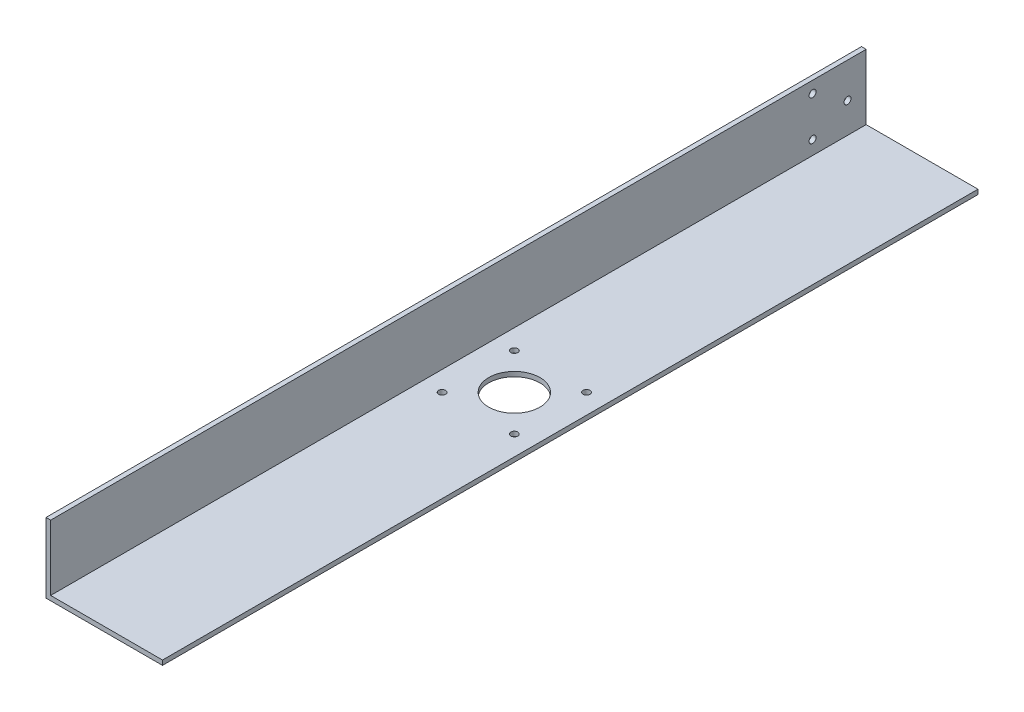
ISO-10303-21;
HEADER;
FILE_DESCRIPTION(('STEP AP214'),'2;1');
FILE_NAME('part.step','',(''),(''),'','','');
FILE_SCHEMA(('AUTOMOTIVE_DESIGN { 1 0 10303 214 1 1 1 1 }'));
ENDSEC;
DATA;
#1=APPLICATION_CONTEXT('core data for automotive mechanical design processes');
#2=APPLICATION_PROTOCOL_DEFINITION('international standard','automotive_design',2000,#1);
#3=PRODUCT_CONTEXT('',#1,'mechanical');
#4=PRODUCT('Part','Part','',(#3));
#5=PRODUCT_RELATED_PRODUCT_CATEGORY('part','',(#4));
#6=PRODUCT_DEFINITION_FORMATION('','',#4);
#7=PRODUCT_DEFINITION_CONTEXT('part definition',#1,'design');
#8=PRODUCT_DEFINITION('design','',#6,#7);
#9=PRODUCT_DEFINITION_SHAPE('','',#8);
#10=(LENGTH_UNIT() NAMED_UNIT(*) SI_UNIT(.MILLI.,.METRE.));
#11=(NAMED_UNIT(*) PLANE_ANGLE_UNIT() SI_UNIT($,.RADIAN.));
#12=(NAMED_UNIT(*) SI_UNIT($,.STERADIAN.) SOLID_ANGLE_UNIT());
#13=UNCERTAINTY_MEASURE_WITH_UNIT(LENGTH_MEASURE(1.E-05),#10,'distance_accuracy_value','');
#14=(GEOMETRIC_REPRESENTATION_CONTEXT(3) GLOBAL_UNCERTAINTY_ASSIGNED_CONTEXT((#13)) GLOBAL_UNIT_ASSIGNED_CONTEXT((#10,
#11,#12)) REPRESENTATION_CONTEXT('',''));
#15=CARTESIAN_POINT('',(0.,0.,0.));
#16=DIRECTION('',(0.,0.,1.));
#17=DIRECTION('',(1.,0.,0.));
#18=AXIS2_PLACEMENT_3D('',#15,#16,#17);
#19=CARTESIAN_POINT('',(0.,0.,0.));
#20=DIRECTION('',(0.,0.,-1.));
#21=DIRECTION('',(-1.,0.,0.));
#22=AXIS2_PLACEMENT_3D('',#19,#20,#21);
#23=PLANE('',#22);
#24=DIRECTION('',(1.,0.,0.));
#25=VECTOR('',#24,1.);
#26=CARTESIAN_POINT('',(50.,0.,0.));
#27=LINE('',#26,#25);
#28=CARTESIAN_POINT('',(0.,0.,0.));
#29=VERTEX_POINT('',#28);
#30=CARTESIAN_POINT('',(50.,0.,0.));
#31=VERTEX_POINT('',#30);
#32=EDGE_CURVE('E99',#29,#31,#27,.T.);
#33=ORIENTED_EDGE('',*,*,#32,.F.);
#34=DIRECTION('',(0.,-1.,0.));
#35=VECTOR('',#34,1.);
#36=CARTESIAN_POINT('',(0.,0.,0.));
#37=LINE('',#36,#35);
#38=CARTESIAN_POINT('',(0.,30.,0.));
#39=VERTEX_POINT('',#38);
#40=EDGE_CURVE('E121',#39,#29,#37,.T.);
#41=ORIENTED_EDGE('',*,*,#40,.F.);
#42=DIRECTION('',(-1.,0.,0.));
#43=VECTOR('',#42,1.);
#44=CARTESIAN_POINT('',(0.,30.,0.));
#45=LINE('',#44,#43);
#46=CARTESIAN_POINT('',(2.,30.,0.));
#47=VERTEX_POINT('',#46);
#48=EDGE_CURVE('E118',#47,#39,#45,.T.);
#49=ORIENTED_EDGE('',*,*,#48,.F.);
#50=DIRECTION('',(0.,1.,0.));
#51=VECTOR('',#50,1.);
#52=CARTESIAN_POINT('',(2.,30.,0.));
#53=LINE('',#52,#51);
#54=CARTESIAN_POINT('',(2.,2.,0.));
#55=VERTEX_POINT('',#54);
#56=EDGE_CURVE('E115',#55,#47,#53,.T.);
#57=ORIENTED_EDGE('',*,*,#56,.F.);
#58=DIRECTION('',(-1.,0.,0.));
#59=VECTOR('',#58,1.);
#60=CARTESIAN_POINT('',(2.,2.,0.));
#61=LINE('',#60,#59);
#62=CARTESIAN_POINT('',(50.,2.,0.));
#63=VERTEX_POINT('',#62);
#64=EDGE_CURVE('E102',#63,#55,#61,.T.);
#65=ORIENTED_EDGE('',*,*,#64,.F.);
#66=DIRECTION('',(0.,1.,0.));
#67=VECTOR('',#66,1.);
#68=CARTESIAN_POINT('',(50.,2.,0.));
#69=LINE('',#68,#67);
#70=EDGE_CURVE('E91',#31,#63,#69,.T.);
#71=ORIENTED_EDGE('',*,*,#70,.F.);
#72=EDGE_LOOP('',(#33,#41,#49,#57,#65,#71));
#73=FACE_BOUND('',#72,.T.);
#74=ADVANCED_FACE('F35',(#73),#23,.T.);
#75=CARTESIAN_POINT('',(0.,0.,408.309518948453));
#76=DIRECTION('',(1.,0.,0.));
#77=DIRECTION('',(0.,0.,-1.));
#78=AXIS2_PLACEMENT_3D('',#75,#76,#77);
#79=PLANE('',#78);
#80=CARTESIAN_POINT('',(0.,7.99999999999998,22.9999999999999));
#81=DIRECTION('',(-1.,0.,0.));
#82=DIRECTION('',(0.,0.,1.));
#83=AXIS2_PLACEMENT_3D('',#80,#81,#82);
#84=CIRCLE('',#83,1.49999999999999);
#85=CARTESIAN_POINT('',(0.,7.99999999999998,24.4999999999999));
#86=VERTEX_POINT('',#85);
#87=EDGE_CURVE('E181',#86,#86,#84,.T.);
#88=ORIENTED_EDGE('',*,*,#87,.F.);
#89=EDGE_LOOP('',(#88));
#90=FACE_BOUND('',#89,.T.);
#91=CARTESIAN_POINT('',(0.,25.,22.9999999999999));
#92=DIRECTION('',(-1.,0.,0.));
#93=DIRECTION('',(0.,0.,1.));
#94=AXIS2_PLACEMENT_3D('',#91,#92,#93);
#95=CIRCLE('',#94,1.49999999999999);
#96=CARTESIAN_POINT('',(0.,25.,24.4999999999999));
#97=VERTEX_POINT('',#96);
#98=EDGE_CURVE('E175',#97,#97,#95,.T.);
#99=ORIENTED_EDGE('',*,*,#98,.F.);
#100=EDGE_LOOP('',(#99));
#101=FACE_BOUND('',#100,.T.);
#102=CARTESIAN_POINT('',(0.,15.,7.99999999999994));
#103=DIRECTION('',(-1.,0.,0.));
#104=DIRECTION('',(0.,0.,1.));
#105=AXIS2_PLACEMENT_3D('',#102,#103,#104);
#106=CIRCLE('',#105,1.49999999999999);
#107=CARTESIAN_POINT('',(0.,15.,9.49999999999993));
#108=VERTEX_POINT('',#107);
#109=EDGE_CURVE('E169',#108,#108,#106,.T.);
#110=ORIENTED_EDGE('',*,*,#109,.F.);
#111=EDGE_LOOP('',(#110));
#112=FACE_BOUND('',#111,.T.);
#113=DIRECTION('',(0.,0.,-1.));
#114=VECTOR('',#113,1.);
#115=CARTESIAN_POINT('',(0.,0.,408.309518948453));
#116=LINE('',#115,#114);
#117=CARTESIAN_POINT('',(0.,0.,350.));
#118=VERTEX_POINT('',#117);
#119=EDGE_CURVE('E105',#118,#29,#116,.T.);
#120=ORIENTED_EDGE('',*,*,#119,.F.);
#121=DIRECTION('',(0.,1.,0.));
#122=VECTOR('',#121,1.);
#123=CARTESIAN_POINT('',(0.,0.,350.));
#124=LINE('',#123,#122);
#125=CARTESIAN_POINT('',(0.,30.,350.));
#126=VERTEX_POINT('',#125);
#127=EDGE_CURVE('E39',#118,#126,#124,.T.);
#128=ORIENTED_EDGE('',*,*,#127,.T.);
#129=DIRECTION('',(0.,0.,-1.));
#130=VECTOR('',#129,1.);
#131=CARTESIAN_POINT('',(0.,30.,408.309518948453));
#132=LINE('',#131,#130);
#133=EDGE_CURVE('E124',#126,#39,#132,.T.);
#134=ORIENTED_EDGE('',*,*,#133,.T.);
#135=ORIENTED_EDGE('',*,*,#40,.T.);
#136=EDGE_LOOP('',(#120,#128,#134,#135));
#137=FACE_BOUND('',#136,.T.);
#138=ADVANCED_FACE('F187',(#90,#101,#112,#137),#79,.F.);
#139=CARTESIAN_POINT('',(0.,30.,408.309518948453));
#140=DIRECTION('',(0.,-1.,0.));
#141=DIRECTION('',(0.,0.,-1.));
#142=AXIS2_PLACEMENT_3D('',#139,#140,#141);
#143=PLANE('',#142);
#144=ORIENTED_EDGE('',*,*,#133,.F.);
#145=DIRECTION('',(1.,0.,0.));
#146=VECTOR('',#145,1.);
#147=CARTESIAN_POINT('',(0.,30.,350.));
#148=LINE('',#147,#146);
#149=CARTESIAN_POINT('',(2.,30.,350.));
#150=VERTEX_POINT('',#149);
#151=EDGE_CURVE('E135',#126,#150,#148,.T.);
#152=ORIENTED_EDGE('',*,*,#151,.T.);
#153=DIRECTION('',(0.,0.,-1.));
#154=VECTOR('',#153,1.);
#155=CARTESIAN_POINT('',(2.,30.,408.309518948453));
#156=LINE('',#155,#154);
#157=EDGE_CURVE('E126',#150,#47,#156,.T.);
#158=ORIENTED_EDGE('',*,*,#157,.T.);
#159=ORIENTED_EDGE('',*,*,#48,.T.);
#160=EDGE_LOOP('',(#144,#152,#158,#159));
#161=FACE_BOUND('',#160,.T.);
#162=ADVANCED_FACE('F190',(#161),#143,.F.);
#163=CARTESIAN_POINT('',(2.,30.,408.309518948453));
#164=DIRECTION('',(-1.,0.,0.));
#165=DIRECTION('',(0.,0.,1.));
#166=AXIS2_PLACEMENT_3D('',#163,#164,#165);
#167=PLANE('',#166);
#168=CARTESIAN_POINT('',(2.,7.99999999999998,22.9999999999999));
#169=DIRECTION('',(-1.,0.,0.));
#170=DIRECTION('',(0.,0.,1.));
#171=AXIS2_PLACEMENT_3D('',#168,#169,#170);
#172=CIRCLE('',#171,1.5);
#173=CARTESIAN_POINT('',(2.,7.99999999999998,24.4999999999999));
#174=VERTEX_POINT('',#173);
#175=EDGE_CURVE('E178',#174,#174,#172,.T.);
#176=ORIENTED_EDGE('',*,*,#175,.T.);
#177=EDGE_LOOP('',(#176));
#178=FACE_BOUND('',#177,.T.);
#179=CARTESIAN_POINT('',(2.,25.,22.9999999999999));
#180=DIRECTION('',(-1.,0.,0.));
#181=DIRECTION('',(0.,0.,1.));
#182=AXIS2_PLACEMENT_3D('',#179,#180,#181);
#183=CIRCLE('',#182,1.5);
#184=CARTESIAN_POINT('',(2.,25.,24.4999999999999));
#185=VERTEX_POINT('',#184);
#186=EDGE_CURVE('E172',#185,#185,#183,.T.);
#187=ORIENTED_EDGE('',*,*,#186,.T.);
#188=EDGE_LOOP('',(#187));
#189=FACE_BOUND('',#188,.T.);
#190=CARTESIAN_POINT('',(2.,15.,7.99999999999994));
#191=DIRECTION('',(-1.,0.,0.));
#192=DIRECTION('',(0.,0.,1.));
#193=AXIS2_PLACEMENT_3D('',#190,#191,#192);
#194=CIRCLE('',#193,1.5);
#195=CARTESIAN_POINT('',(2.,15.,9.49999999999994));
#196=VERTEX_POINT('',#195);
#197=EDGE_CURVE('E153',#196,#196,#194,.T.);
#198=ORIENTED_EDGE('',*,*,#197,.T.);
#199=EDGE_LOOP('',(#198));
#200=FACE_BOUND('',#199,.T.);
#201=ORIENTED_EDGE('',*,*,#157,.F.);
#202=DIRECTION('',(0.,-1.,0.));
#203=VECTOR('',#202,1.);
#204=CARTESIAN_POINT('',(2.,30.,350.));
#205=LINE('',#204,#203);
#206=CARTESIAN_POINT('',(2.,2.,350.));
#207=VERTEX_POINT('',#206);
#208=EDGE_CURVE('E133',#150,#207,#205,.T.);
#209=ORIENTED_EDGE('',*,*,#208,.T.);
#210=DIRECTION('',(0.,0.,-1.));
#211=VECTOR('',#210,1.);
#212=CARTESIAN_POINT('',(2.,2.,408.309518948453));
#213=LINE('',#212,#211);
#214=EDGE_CURVE('E128',#207,#55,#213,.T.);
#215=ORIENTED_EDGE('',*,*,#214,.T.);
#216=ORIENTED_EDGE('',*,*,#56,.T.);
#217=EDGE_LOOP('',(#201,#209,#215,#216));
#218=FACE_BOUND('',#217,.T.);
#219=ADVANCED_FACE('F202',(#178,#189,#200,#218),#167,.F.);
#220=CARTESIAN_POINT('',(2.,2.,408.309518948453));
#221=DIRECTION('',(0.,-1.,0.));
#222=DIRECTION('',(0.,0.,-1.));
#223=AXIS2_PLACEMENT_3D('',#220,#221,#222);
#224=PLANE('',#223);
#225=CARTESIAN_POINT('',(41.5000000000025,2.,159.5));
#226=DIRECTION('',(0.,1.,0.));
#227=DIRECTION('',(0.,0.,1.));
#228=AXIS2_PLACEMENT_3D('',#225,#226,#227);
#229=CIRCLE('',#228,1.49999999621088);
#230=CARTESIAN_POINT('',(41.5000000000025,2.,160.999999996211));
#231=VERTEX_POINT('',#230);
#232=EDGE_CURVE('E162',#231,#231,#229,.T.);
#233=ORIENTED_EDGE('',*,*,#232,.F.);
#234=EDGE_LOOP('',(#233));
#235=FACE_BOUND('',#234,.T.);
#236=CARTESIAN_POINT('',(10.5000000000025,2.,190.5));
#237=DIRECTION('',(0.,1.,0.));
#238=DIRECTION('',(0.,0.,1.));
#239=AXIS2_PLACEMENT_3D('',#236,#237,#238);
#240=CIRCLE('',#239,1.49999999621087);
#241=CARTESIAN_POINT('',(10.5000000000025,2.,191.999999996211));
#242=VERTEX_POINT('',#241);
#243=EDGE_CURVE('E156',#242,#242,#240,.T.);
#244=ORIENTED_EDGE('',*,*,#243,.F.);
#245=EDGE_LOOP('',(#244));
#246=FACE_BOUND('',#245,.T.);
#247=CARTESIAN_POINT('',(10.5000000000025,2.,159.5));
#248=DIRECTION('',(0.,1.,0.));
#249=DIRECTION('',(0.,0.,1.));
#250=AXIS2_PLACEMENT_3D('',#247,#248,#249);
#251=CIRCLE('',#250,1.49999999621087);
#252=CARTESIAN_POINT('',(10.5000000000025,2.,160.999999996211));
#253=VERTEX_POINT('',#252);
#254=EDGE_CURVE('E149',#253,#253,#251,.T.);
#255=ORIENTED_EDGE('',*,*,#254,.F.);
#256=EDGE_LOOP('',(#255));
#257=FACE_BOUND('',#256,.T.);
#258=CARTESIAN_POINT('',(41.5000000000025,2.,190.5));
#259=DIRECTION('',(0.,1.,0.));
#260=DIRECTION('',(0.,0.,1.));
#261=AXIS2_PLACEMENT_3D('',#258,#259,#260);
#262=CIRCLE('',#261,1.49999999621088);
#263=CARTESIAN_POINT('',(41.5000000000025,2.,191.999999996211));
#264=VERTEX_POINT('',#263);
#265=EDGE_CURVE('E143',#264,#264,#262,.T.);
#266=ORIENTED_EDGE('',*,*,#265,.F.);
#267=EDGE_LOOP('',(#266));
#268=FACE_BOUND('',#267,.T.);
#269=CARTESIAN_POINT('',(26.0000000000025,2.,175.));
#270=DIRECTION('',(0.,-1.,0.));
#271=DIRECTION('',(0.,0.,-1.));
#272=AXIS2_PLACEMENT_3D('',#269,#270,#271);
#273=CIRCLE('',#272,10.9999999962109);
#274=CARTESIAN_POINT('',(26.0000000000025,2.,164.000000003789));
#275=VERTEX_POINT('',#274);
#276=EDGE_CURVE('E110',#275,#275,#273,.T.);
#277=ORIENTED_EDGE('',*,*,#276,.T.);
#278=EDGE_LOOP('',(#277));
#279=FACE_BOUND('',#278,.T.);
#280=ORIENTED_EDGE('',*,*,#214,.F.);
#281=DIRECTION('',(1.,0.,0.));
#282=VECTOR('',#281,1.);
#283=CARTESIAN_POINT('',(2.00000000000002,2.,350.));
#284=LINE('',#283,#282);
#285=CARTESIAN_POINT('',(50.,2.,350.));
#286=VERTEX_POINT('',#285);
#287=EDGE_CURVE('E56',#207,#286,#284,.T.);
#288=ORIENTED_EDGE('',*,*,#287,.T.);
#289=DIRECTION('',(0.,0.,-1.));
#290=VECTOR('',#289,1.);
#291=CARTESIAN_POINT('',(50.,2.,408.309518948453));
#292=LINE('',#291,#290);
#293=EDGE_CURVE('E95',#286,#63,#292,.T.);
#294=ORIENTED_EDGE('',*,*,#293,.T.);
#295=ORIENTED_EDGE('',*,*,#64,.T.);
#296=EDGE_LOOP('',(#280,#288,#294,#295));
#297=FACE_BOUND('',#296,.T.);
#298=ADVANCED_FACE('F131',(#235,#246,#257,#268,#279,#297),#224,.F.);
#299=CARTESIAN_POINT('',(50.,2.,408.309518948453));
#300=DIRECTION('',(-1.,0.,0.));
#301=DIRECTION('',(0.,0.,1.));
#302=AXIS2_PLACEMENT_3D('',#299,#300,#301);
#303=PLANE('',#302);
#304=ORIENTED_EDGE('',*,*,#293,.F.);
#305=DIRECTION('',(0.,-1.,0.));
#306=VECTOR('',#305,1.);
#307=CARTESIAN_POINT('',(50.,2.,350.));
#308=LINE('',#307,#306);
#309=CARTESIAN_POINT('',(50.,0.,350.));
#310=VERTEX_POINT('',#309);
#311=EDGE_CURVE('E44',#286,#310,#308,.T.);
#312=ORIENTED_EDGE('',*,*,#311,.T.);
#313=DIRECTION('',(0.,0.,-1.));
#314=VECTOR('',#313,1.);
#315=CARTESIAN_POINT('',(50.,0.,408.309518948453));
#316=LINE('',#315,#314);
#317=EDGE_CURVE('E88',#310,#31,#316,.T.);
#318=ORIENTED_EDGE('',*,*,#317,.T.);
#319=ORIENTED_EDGE('',*,*,#70,.T.);
#320=EDGE_LOOP('',(#304,#312,#318,#319));
#321=FACE_BOUND('',#320,.T.);
#322=ADVANCED_FACE('F90',(#321),#303,.F.);
#323=CARTESIAN_POINT('',(50.,0.,408.309518948453));
#324=DIRECTION('',(0.,1.,0.));
#325=DIRECTION('',(-1.,0.,0.));
#326=AXIS2_PLACEMENT_3D('',#323,#324,#325);
#327=PLANE('',#326);
#328=CARTESIAN_POINT('',(41.5000000000025,0.,159.5));
#329=DIRECTION('',(0.,1.,0.));
#330=DIRECTION('',(0.,0.,1.));
#331=AXIS2_PLACEMENT_3D('',#328,#329,#330);
#332=CIRCLE('',#331,1.49999999621088);
#333=CARTESIAN_POINT('',(41.5000000000025,0.,160.999999996211));
#334=VERTEX_POINT('',#333);
#335=EDGE_CURVE('E146',#334,#334,#332,.T.);
#336=ORIENTED_EDGE('',*,*,#335,.T.);
#337=EDGE_LOOP('',(#336));
#338=FACE_BOUND('',#337,.T.);
#339=CARTESIAN_POINT('',(10.5000000000025,0.,190.5));
#340=DIRECTION('',(0.,1.,0.));
#341=DIRECTION('',(0.,0.,1.));
#342=AXIS2_PLACEMENT_3D('',#339,#340,#341);
#343=CIRCLE('',#342,1.49999999621087);
#344=CARTESIAN_POINT('',(10.5000000000025,0.,191.999999996211));
#345=VERTEX_POINT('',#344);
#346=EDGE_CURVE('E159',#345,#345,#343,.T.);
#347=ORIENTED_EDGE('',*,*,#346,.T.);
#348=EDGE_LOOP('',(#347));
#349=FACE_BOUND('',#348,.T.);
#350=CARTESIAN_POINT('',(10.5000000000025,0.,159.5));
#351=DIRECTION('',(0.,1.,0.));
#352=DIRECTION('',(0.,0.,1.));
#353=AXIS2_PLACEMENT_3D('',#350,#351,#352);
#354=CIRCLE('',#353,1.49999999621087);
#355=CARTESIAN_POINT('',(10.5000000000025,0.,160.999999996211));
#356=VERTEX_POINT('',#355);
#357=EDGE_CURVE('E152',#356,#356,#354,.T.);
#358=ORIENTED_EDGE('',*,*,#357,.T.);
#359=EDGE_LOOP('',(#358));
#360=FACE_BOUND('',#359,.T.);
#361=CARTESIAN_POINT('',(41.5000000000025,0.,190.5));
#362=DIRECTION('',(0.,1.,0.));
#363=DIRECTION('',(0.,0.,1.));
#364=AXIS2_PLACEMENT_3D('',#361,#362,#363);
#365=CIRCLE('',#364,1.49999999621088);
#366=CARTESIAN_POINT('',(41.5000000000025,0.,191.999999996211));
#367=VERTEX_POINT('',#366);
#368=EDGE_CURVE('E141',#367,#367,#365,.T.);
#369=ORIENTED_EDGE('',*,*,#368,.T.);
#370=EDGE_LOOP('',(#369));
#371=FACE_BOUND('',#370,.T.);
#372=CARTESIAN_POINT('',(26.0000000000025,0.,175.));
#373=DIRECTION('',(0.,-1.,0.));
#374=DIRECTION('',(0.,0.,-1.));
#375=AXIS2_PLACEMENT_3D('',#372,#373,#374);
#376=CIRCLE('',#375,10.9999999962109);
#377=CARTESIAN_POINT('',(26.0000000000025,0.,164.000000003789));
#378=VERTEX_POINT('',#377);
#379=EDGE_CURVE('E107',#378,#378,#376,.T.);
#380=ORIENTED_EDGE('',*,*,#379,.F.);
#381=EDGE_LOOP('',(#380));
#382=FACE_BOUND('',#381,.T.);
#383=ORIENTED_EDGE('',*,*,#317,.F.);
#384=DIRECTION('',(-1.,0.,0.));
#385=VECTOR('',#384,1.);
#386=CARTESIAN_POINT('',(50.,0.,350.));
#387=LINE('',#386,#385);
#388=EDGE_CURVE('E11',#310,#118,#387,.T.);
#389=ORIENTED_EDGE('',*,*,#388,.T.);
#390=ORIENTED_EDGE('',*,*,#119,.T.);
#391=ORIENTED_EDGE('',*,*,#32,.T.);
#392=EDGE_LOOP('',(#383,#389,#390,#391));
#393=FACE_BOUND('',#392,.T.);
#394=ADVANCED_FACE('F37',(#338,#349,#360,#371,#382,#393),#327,.F.);
#395=CARTESIAN_POINT('',(0.,-58.9999999999675,350.));
#396=DIRECTION('',(0.,0.,-1.));
#397=DIRECTION('',(0.,1.,0.));
#398=AXIS2_PLACEMENT_3D('',#395,#396,#397);
#399=PLANE('',#398);
#400=ORIENTED_EDGE('',*,*,#311,.F.);
#401=ORIENTED_EDGE('',*,*,#287,.F.);
#402=ORIENTED_EDGE('',*,*,#208,.F.);
#403=ORIENTED_EDGE('',*,*,#151,.F.);
#404=ORIENTED_EDGE('',*,*,#127,.F.);
#405=ORIENTED_EDGE('',*,*,#388,.F.);
#406=EDGE_LOOP('',(#400,#401,#402,#403,#404,#405));
#407=FACE_BOUND('',#406,.T.);
#408=ADVANCED_FACE('F203',(#407),#399,.F.);
#409=CARTESIAN_POINT('',(26.0000000000025,0.,175.));
#410=DIRECTION('',(0.,1.,0.));
#411=DIRECTION('',(0.,0.,1.));
#412=AXIS2_PLACEMENT_3D('',#409,#410,#411);
#413=CYLINDRICAL_SURFACE('',#412,10.9999999962109);
#414=ORIENTED_EDGE('',*,*,#379,.T.);
#415=EDGE_LOOP('',(#414));
#416=FACE_BOUND('',#415,.T.);
#417=ORIENTED_EDGE('',*,*,#276,.F.);
#418=EDGE_LOOP('',(#417));
#419=FACE_BOUND('',#418,.T.);
#420=ADVANCED_FACE('F205',(#416,#419),#413,.F.);
#421=CARTESIAN_POINT('',(41.5000000000025,0.,190.5));
#422=DIRECTION('',(0.,1.,0.));
#423=DIRECTION('',(0.,0.,1.));
#424=AXIS2_PLACEMENT_3D('',#421,#422,#423);
#425=CYLINDRICAL_SURFACE('',#424,1.49999999621088);
#426=ORIENTED_EDGE('',*,*,#368,.F.);
#427=EDGE_LOOP('',(#426));
#428=FACE_BOUND('',#427,.T.);
#429=ORIENTED_EDGE('',*,*,#265,.T.);
#430=EDGE_LOOP('',(#429));
#431=FACE_BOUND('',#430,.T.);
#432=ADVANCED_FACE('F211',(#428,#431),#425,.F.);
#433=CARTESIAN_POINT('',(10.5000000000025,0.,159.5));
#434=DIRECTION('',(0.,1.,0.));
#435=DIRECTION('',(0.,0.,1.));
#436=AXIS2_PLACEMENT_3D('',#433,#434,#435);
#437=CYLINDRICAL_SURFACE('',#436,1.49999999621087);
#438=ORIENTED_EDGE('',*,*,#357,.F.);
#439=EDGE_LOOP('',(#438));
#440=FACE_BOUND('',#439,.T.);
#441=ORIENTED_EDGE('',*,*,#254,.T.);
#442=EDGE_LOOP('',(#441));
#443=FACE_BOUND('',#442,.T.);
#444=ADVANCED_FACE('F252',(#440,#443),#437,.F.);
#445=CARTESIAN_POINT('',(10.5000000000025,0.,190.5));
#446=DIRECTION('',(0.,1.,0.));
#447=DIRECTION('',(0.,0.,1.));
#448=AXIS2_PLACEMENT_3D('',#445,#446,#447);
#449=CYLINDRICAL_SURFACE('',#448,1.49999999621087);
#450=ORIENTED_EDGE('',*,*,#346,.F.);
#451=EDGE_LOOP('',(#450));
#452=FACE_BOUND('',#451,.T.);
#453=ORIENTED_EDGE('',*,*,#243,.T.);
#454=EDGE_LOOP('',(#453));
#455=FACE_BOUND('',#454,.T.);
#456=ADVANCED_FACE('F263',(#452,#455),#449,.F.);
#457=CARTESIAN_POINT('',(41.5000000000025,0.,159.5));
#458=DIRECTION('',(0.,1.,0.));
#459=DIRECTION('',(0.,0.,1.));
#460=AXIS2_PLACEMENT_3D('',#457,#458,#459);
#461=CYLINDRICAL_SURFACE('',#460,1.49999999621088);
#462=ORIENTED_EDGE('',*,*,#335,.F.);
#463=EDGE_LOOP('',(#462));
#464=FACE_BOUND('',#463,.T.);
#465=ORIENTED_EDGE('',*,*,#232,.T.);
#466=EDGE_LOOP('',(#465));
#467=FACE_BOUND('',#466,.T.);
#468=ADVANCED_FACE('F273',(#464,#467),#461,.F.);
#469=CARTESIAN_POINT('',(0.,15.,7.99999999999994));
#470=DIRECTION('',(-1.,0.,0.));
#471=DIRECTION('',(0.,0.,1.));
#472=AXIS2_PLACEMENT_3D('',#469,#470,#471);
#473=CYLINDRICAL_SURFACE('',#472,1.49999999999999);
#474=ORIENTED_EDGE('',*,*,#197,.F.);
#475=EDGE_LOOP('',(#474));
#476=FACE_BOUND('',#475,.T.);
#477=ORIENTED_EDGE('',*,*,#109,.T.);
#478=EDGE_LOOP('',(#477));
#479=FACE_BOUND('',#478,.T.);
#480=ADVANCED_FACE('F282',(#476,#479),#473,.F.);
#481=CARTESIAN_POINT('',(0.,25.,22.9999999999999));
#482=DIRECTION('',(-1.,0.,0.));
#483=DIRECTION('',(0.,0.,1.));
#484=AXIS2_PLACEMENT_3D('',#481,#482,#483);
#485=CYLINDRICAL_SURFACE('',#484,1.49999999999999);
#486=ORIENTED_EDGE('',*,*,#186,.F.);
#487=EDGE_LOOP('',(#486));
#488=FACE_BOUND('',#487,.T.);
#489=ORIENTED_EDGE('',*,*,#98,.T.);
#490=EDGE_LOOP('',(#489));
#491=FACE_BOUND('',#490,.T.);
#492=ADVANCED_FACE('F299',(#488,#491),#485,.F.);
#493=CARTESIAN_POINT('',(0.,7.99999999999998,22.9999999999999));
#494=DIRECTION('',(-1.,0.,0.));
#495=DIRECTION('',(0.,0.,1.));
#496=AXIS2_PLACEMENT_3D('',#493,#494,#495);
#497=CYLINDRICAL_SURFACE('',#496,1.49999999999999);
#498=ORIENTED_EDGE('',*,*,#175,.F.);
#499=EDGE_LOOP('',(#498));
#500=FACE_BOUND('',#499,.T.);
#501=ORIENTED_EDGE('',*,*,#87,.T.);
#502=EDGE_LOOP('',(#501));
#503=FACE_BOUND('',#502,.T.);
#504=ADVANCED_FACE('F185',(#500,#503),#497,.F.);
#505=CLOSED_SHELL('',(#74,#138,#162,#219,#298,#322,#394,#408,#420,#432,#444,#456,#468,#480,#492,#504));
#506=MANIFOLD_SOLID_BREP('B2',#505);
#507=ADVANCED_BREP_SHAPE_REPRESENTATION('',(#18,#506),#14);
#508=SHAPE_DEFINITION_REPRESENTATION(#9,#507);
ENDSEC;
END-ISO-10303-21;
